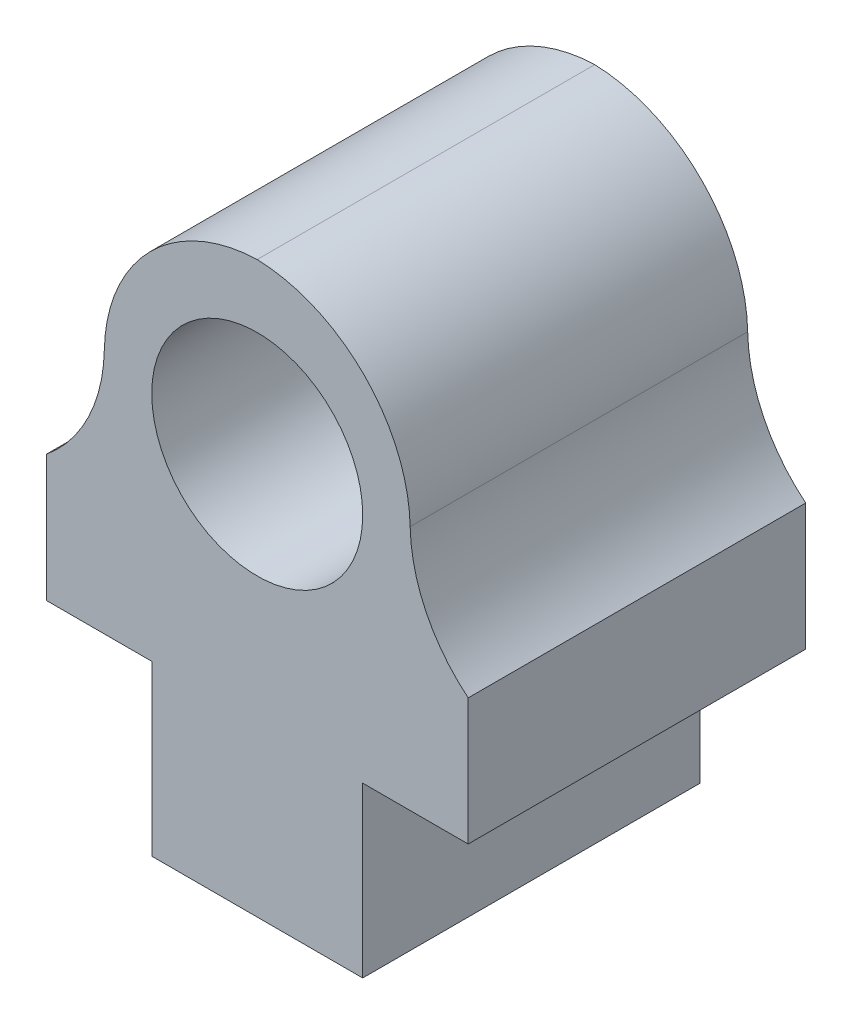
ISO-10303-21;
HEADER;
FILE_DESCRIPTION(('STEP AP214'),'2;1');
FILE_NAME('part.step','',(''),(''),'','','');
FILE_SCHEMA(('AUTOMOTIVE_DESIGN { 1 0 10303 214 1 1 1 1 }'));
ENDSEC;
DATA;
#1=APPLICATION_CONTEXT('core data for automotive mechanical design processes');
#2=APPLICATION_PROTOCOL_DEFINITION('international standard','automotive_design',2000,#1);
#3=PRODUCT_CONTEXT('',#1,'mechanical');
#4=PRODUCT('Part','Part','',(#3));
#5=PRODUCT_RELATED_PRODUCT_CATEGORY('part','',(#4));
#6=PRODUCT_DEFINITION_FORMATION('','',#4);
#7=PRODUCT_DEFINITION_CONTEXT('part definition',#1,'design');
#8=PRODUCT_DEFINITION('design','',#6,#7);
#9=PRODUCT_DEFINITION_SHAPE('','',#8);
#10=(LENGTH_UNIT() NAMED_UNIT(*) SI_UNIT(.MILLI.,.METRE.));
#11=(NAMED_UNIT(*) PLANE_ANGLE_UNIT() SI_UNIT($,.RADIAN.));
#12=(NAMED_UNIT(*) SI_UNIT($,.STERADIAN.) SOLID_ANGLE_UNIT());
#13=UNCERTAINTY_MEASURE_WITH_UNIT(LENGTH_MEASURE(1.E-05),#10,'distance_accuracy_value','');
#14=(GEOMETRIC_REPRESENTATION_CONTEXT(3) GLOBAL_UNCERTAINTY_ASSIGNED_CONTEXT((#13)) GLOBAL_UNIT_ASSIGNED_CONTEXT((#10,
#11,#12)) REPRESENTATION_CONTEXT('',''));
#15=CARTESIAN_POINT('',(0.,0.,0.));
#16=DIRECTION('',(0.,0.,1.));
#17=DIRECTION('',(1.,0.,0.));
#18=AXIS2_PLACEMENT_3D('',#15,#16,#17);
#19=CARTESIAN_POINT('',(0.,0.,0.));
#20=DIRECTION('',(0.,-1.,0.));
#21=DIRECTION('',(0.,0.,-1.));
#22=AXIS2_PLACEMENT_3D('',#19,#20,#21);
#23=PLANE('',#22);
#24=DIRECTION('',(0.,0.,-1.));
#25=VECTOR('',#24,1.);
#26=CARTESIAN_POINT('',(5.,0.,0.));
#27=LINE('',#26,#25);
#28=CARTESIAN_POINT('',(5.,0.,0.));
#29=VERTEX_POINT('',#28);
#30=CARTESIAN_POINT('',(5.,0.,-16.));
#31=VERTEX_POINT('',#30);
#32=EDGE_CURVE('E141',#29,#31,#27,.T.);
#33=ORIENTED_EDGE('',*,*,#32,.F.);
#34=DIRECTION('',(1.,0.,0.));
#35=VECTOR('',#34,1.);
#36=CARTESIAN_POINT('',(0.,0.,0.));
#37=LINE('',#36,#35);
#38=CARTESIAN_POINT('',(0.,0.,0.));
#39=VERTEX_POINT('',#38);
#40=EDGE_CURVE('E158',#39,#29,#37,.T.);
#41=ORIENTED_EDGE('',*,*,#40,.F.);
#42=DIRECTION('',(0.,0.,1.));
#43=VECTOR('',#42,1.);
#44=CARTESIAN_POINT('',(0.,0.,0.));
#45=LINE('',#44,#43);
#46=CARTESIAN_POINT('',(0.,0.,-16.));
#47=VERTEX_POINT('',#46);
#48=EDGE_CURVE('E142',#47,#39,#45,.T.);
#49=ORIENTED_EDGE('',*,*,#48,.F.);
#50=DIRECTION('',(-1.,0.,0.));
#51=VECTOR('',#50,1.);
#52=CARTESIAN_POINT('',(0.,0.,-16.));
#53=LINE('',#52,#51);
#54=EDGE_CURVE('E163',#31,#47,#53,.T.);
#55=ORIENTED_EDGE('',*,*,#54,.F.);
#56=EDGE_LOOP('',(#33,#41,#49,#55));
#57=FACE_BOUND('',#56,.T.);
#58=ADVANCED_FACE('F37',(#57),#23,.T.);
#59=CARTESIAN_POINT('',(0.,6.,0.));
#60=DIRECTION('',(1.,0.,0.));
#61=DIRECTION('',(0.,0.,-1.));
#62=AXIS2_PLACEMENT_3D('',#59,#60,#61);
#63=PLANE('',#62);
#64=ORIENTED_EDGE('',*,*,#48,.T.);
#65=DIRECTION('',(0.,-1.,0.));
#66=VECTOR('',#65,1.);
#67=CARTESIAN_POINT('',(0.,6.,0.));
#68=LINE('',#67,#66);
#69=CARTESIAN_POINT('',(0.,6.,0.));
#70=VERTEX_POINT('',#69);
#71=EDGE_CURVE('E173',#70,#39,#68,.T.);
#72=ORIENTED_EDGE('',*,*,#71,.F.);
#73=DIRECTION('',(0.,0.,1.));
#74=VECTOR('',#73,1.);
#75=CARTESIAN_POINT('',(0.,6.,0.));
#76=LINE('',#75,#74);
#77=CARTESIAN_POINT('',(0.,6.,-16.));
#78=VERTEX_POINT('',#77);
#79=EDGE_CURVE('E151',#78,#70,#76,.T.);
#80=ORIENTED_EDGE('',*,*,#79,.F.);
#81=DIRECTION('',(0.,-1.,0.));
#82=VECTOR('',#81,1.);
#83=CARTESIAN_POINT('',(0.,6.,-16.));
#84=LINE('',#83,#82);
#85=EDGE_CURVE('E156',#78,#47,#84,.T.);
#86=ORIENTED_EDGE('',*,*,#85,.T.);
#87=EDGE_LOOP('',(#64,#72,#80,#86));
#88=FACE_BOUND('',#87,.T.);
#89=ADVANCED_FACE('F204',(#88),#63,.F.);
#90=CARTESIAN_POINT('',(0.,6.,0.));
#91=DIRECTION('',(0.,0.,-1.));
#92=DIRECTION('',(-1.,0.,0.));
#93=AXIS2_PLACEMENT_3D('',#90,#91,#92);
#94=PLANE('',#93);
#95=CARTESIAN_POINT('',(10.,11.,0.));
#96=DIRECTION('',(0.,0.,1.));
#97=DIRECTION('',(1.,0.,0.));
#98=AXIS2_PLACEMENT_3D('',#95,#96,#97);
#99=CIRCLE('',#98,5.);
#100=CARTESIAN_POINT('',(15.,11.,0.));
#101=VERTEX_POINT('',#100);
#102=EDGE_CURVE('E190',#101,#101,#99,.T.);
#103=ORIENTED_EDGE('',*,*,#102,.F.);
#104=EDGE_LOOP('',(#103));
#105=FACE_BOUND('',#104,.T.);
#106=DIRECTION('',(0.,-1.,0.));
#107=VECTOR('',#106,1.);
#108=CARTESIAN_POINT('',(20.,6.,0.));
#109=LINE('',#108,#107);
#110=CARTESIAN_POINT('',(20.,6.,0.));
#111=VERTEX_POINT('',#110);
#112=CARTESIAN_POINT('',(20.,0.,0.));
#113=VERTEX_POINT('',#112);
#114=EDGE_CURVE('E170',#111,#113,#109,.T.);
#115=ORIENTED_EDGE('',*,*,#114,.F.);
#116=CARTESIAN_POINT('',(24.7468650433401,11.8066575807702,0.));
#117=DIRECTION('',(0.,0.,-1.));
#118=DIRECTION('',(-1.,0.,0.));
#119=AXIS2_PLACEMENT_3D('',#116,#117,#118);
#120=CIRCLE('',#119,7.5);
#121=CARTESIAN_POINT('',(17.2484325216701,11.6533287903851,0.));
#122=VERTEX_POINT('',#121);
#123=EDGE_CURVE('E197',#111,#122,#120,.T.);
#124=ORIENTED_EDGE('',*,*,#123,.T.);
#125=CARTESIAN_POINT('',(9.75000000000001,11.5,0.));
#126=DIRECTION('',(0.,0.,-1.));
#127=DIRECTION('',(-1.,0.,0.));
#128=AXIS2_PLACEMENT_3D('',#125,#126,#127);
#129=CIRCLE('',#128,7.5);
#130=CARTESIAN_POINT('',(10.,18.9958321752825,0.));
#131=VERTEX_POINT('',#130);
#132=EDGE_CURVE('E184',#122,#131,#129,.F.);
#133=ORIENTED_EDGE('',*,*,#132,.T.);
#134=CARTESIAN_POINT('',(10.25,11.5,0.));
#135=DIRECTION('',(0.,0.,-1.));
#136=DIRECTION('',(-1.,0.,0.));
#137=AXIS2_PLACEMENT_3D('',#134,#135,#136);
#138=CIRCLE('',#137,7.5);
#139=CARTESIAN_POINT('',(2.75156747832995,11.6533287903851,0.));
#140=VERTEX_POINT('',#139);
#141=EDGE_CURVE('E181',#131,#140,#138,.F.);
#142=ORIENTED_EDGE('',*,*,#141,.T.);
#143=CARTESIAN_POINT('',(-4.74686504334009,11.8066575807702,0.));
#144=DIRECTION('',(0.,0.,-1.));
#145=DIRECTION('',(-1.,0.,0.));
#146=AXIS2_PLACEMENT_3D('',#143,#144,#145);
#147=CIRCLE('',#146,7.5);
#148=EDGE_CURVE('E45',#140,#70,#147,.T.);
#149=ORIENTED_EDGE('',*,*,#148,.T.);
#150=ORIENTED_EDGE('',*,*,#71,.T.);
#151=ORIENTED_EDGE('',*,*,#40,.T.);
#152=DIRECTION('',(0.,1.,0.));
#153=VECTOR('',#152,1.);
#154=CARTESIAN_POINT('',(5.,-8.,0.));
#155=LINE('',#154,#153);
#156=CARTESIAN_POINT('',(5.,-8.,0.));
#157=VERTEX_POINT('',#156);
#158=EDGE_CURVE('E234',#157,#29,#155,.T.);
#159=ORIENTED_EDGE('',*,*,#158,.F.);
#160=DIRECTION('',(-1.,0.,0.));
#161=VECTOR('',#160,1.);
#162=CARTESIAN_POINT('',(5.,-8.,0.));
#163=LINE('',#162,#161);
#164=CARTESIAN_POINT('',(15.,-8.,0.));
#165=VERTEX_POINT('',#164);
#166=EDGE_CURVE('E134',#165,#157,#163,.T.);
#167=ORIENTED_EDGE('',*,*,#166,.F.);
#168=DIRECTION('',(0.,1.,0.));
#169=VECTOR('',#168,1.);
#170=CARTESIAN_POINT('',(15.,-8.,0.));
#171=LINE('',#170,#169);
#172=CARTESIAN_POINT('',(15.,0.,0.));
#173=VERTEX_POINT('',#172);
#174=EDGE_CURVE('E147',#165,#173,#171,.T.);
#175=ORIENTED_EDGE('',*,*,#174,.T.);
#176=EDGE_CURVE('E145',#173,#113,#37,.T.);
#177=ORIENTED_EDGE('',*,*,#176,.T.);
#178=EDGE_LOOP('',(#115,#124,#133,#142,#149,#150,#151,#159,#167,#175,#177));
#179=FACE_BOUND('',#178,.T.);
#180=ADVANCED_FACE('F200',(#105,#179),#94,.F.);
#181=CARTESIAN_POINT('',(20.,6.,0.));
#182=DIRECTION('',(-1.,0.,0.));
#183=DIRECTION('',(0.,0.,1.));
#184=AXIS2_PLACEMENT_3D('',#181,#182,#183);
#185=PLANE('',#184);
#186=DIRECTION('',(0.,0.,-1.));
#187=VECTOR('',#186,1.);
#188=CARTESIAN_POINT('',(20.,0.,0.));
#189=LINE('',#188,#187);
#190=CARTESIAN_POINT('',(20.,0.,-16.));
#191=VERTEX_POINT('',#190);
#192=EDGE_CURVE('E161',#113,#191,#189,.T.);
#193=ORIENTED_EDGE('',*,*,#192,.T.);
#194=DIRECTION('',(0.,-1.,0.));
#195=VECTOR('',#194,1.);
#196=CARTESIAN_POINT('',(20.,6.,-16.));
#197=LINE('',#196,#195);
#198=CARTESIAN_POINT('',(20.,6.,-16.));
#199=VERTEX_POINT('',#198);
#200=EDGE_CURVE('E167',#199,#191,#197,.T.);
#201=ORIENTED_EDGE('',*,*,#200,.F.);
#202=DIRECTION('',(0.,0.,-1.));
#203=VECTOR('',#202,1.);
#204=CARTESIAN_POINT('',(20.,6.,0.));
#205=LINE('',#204,#203);
#206=EDGE_CURVE('E153',#111,#199,#205,.T.);
#207=ORIENTED_EDGE('',*,*,#206,.F.);
#208=ORIENTED_EDGE('',*,*,#114,.T.);
#209=EDGE_LOOP('',(#193,#201,#207,#208));
#210=FACE_BOUND('',#209,.T.);
#211=ADVANCED_FACE('F220',(#210),#185,.F.);
#212=CARTESIAN_POINT('',(0.,6.,-16.));
#213=DIRECTION('',(0.,0.,1.));
#214=DIRECTION('',(1.,0.,0.));
#215=AXIS2_PLACEMENT_3D('',#212,#213,#214);
#216=PLANE('',#215);
#217=CARTESIAN_POINT('',(10.,11.,-16.));
#218=DIRECTION('',(0.,0.,1.));
#219=DIRECTION('',(1.,0.,0.));
#220=AXIS2_PLACEMENT_3D('',#217,#218,#219);
#221=CIRCLE('',#220,5.);
#222=CARTESIAN_POINT('',(15.,11.,-16.));
#223=VERTEX_POINT('',#222);
#224=EDGE_CURVE('E230',#223,#223,#221,.T.);
#225=ORIENTED_EDGE('',*,*,#224,.T.);
#226=EDGE_LOOP('',(#225));
#227=FACE_BOUND('',#226,.T.);
#228=ORIENTED_EDGE('',*,*,#85,.F.);
#229=CARTESIAN_POINT('',(-4.7468650433401,11.8066575807702,-16.));
#230=DIRECTION('',(0.,0.,1.));
#231=DIRECTION('',(1.,0.,0.));
#232=AXIS2_PLACEMENT_3D('',#229,#230,#231);
#233=CIRCLE('',#232,7.5);
#234=CARTESIAN_POINT('',(2.75156747832995,11.6533287903851,-16.));
#235=VERTEX_POINT('',#234);
#236=EDGE_CURVE('E11',#78,#235,#233,.T.);
#237=ORIENTED_EDGE('',*,*,#236,.T.);
#238=CARTESIAN_POINT('',(10.25,11.5,-16.));
#239=DIRECTION('',(0.,0.,1.));
#240=DIRECTION('',(1.,0.,0.));
#241=AXIS2_PLACEMENT_3D('',#238,#239,#240);
#242=CIRCLE('',#241,7.5);
#243=CARTESIAN_POINT('',(10.,18.9958321752825,-16.));
#244=VERTEX_POINT('',#243);
#245=EDGE_CURVE('E176',#235,#244,#242,.F.);
#246=ORIENTED_EDGE('',*,*,#245,.T.);
#247=CARTESIAN_POINT('',(9.75,11.5,-16.));
#248=DIRECTION('',(0.,0.,1.));
#249=DIRECTION('',(1.,0.,0.));
#250=AXIS2_PLACEMENT_3D('',#247,#248,#249);
#251=CIRCLE('',#250,7.5);
#252=CARTESIAN_POINT('',(17.24843252167,11.6533287903851,-16.));
#253=VERTEX_POINT('',#252);
#254=EDGE_CURVE('E178',#244,#253,#251,.F.);
#255=ORIENTED_EDGE('',*,*,#254,.T.);
#256=CARTESIAN_POINT('',(24.7468650433401,11.8066575807702,-16.));
#257=DIRECTION('',(0.,0.,1.));
#258=DIRECTION('',(1.,0.,0.));
#259=AXIS2_PLACEMENT_3D('',#256,#257,#258);
#260=CIRCLE('',#259,7.5);
#261=EDGE_CURVE('E195',#253,#199,#260,.T.);
#262=ORIENTED_EDGE('',*,*,#261,.T.);
#263=ORIENTED_EDGE('',*,*,#200,.T.);
#264=CARTESIAN_POINT('',(15.,0.,-16.));
#265=VERTEX_POINT('',#264);
#266=EDGE_CURVE('E154',#191,#265,#53,.T.);
#267=ORIENTED_EDGE('',*,*,#266,.T.);
#268=DIRECTION('',(0.,1.,0.));
#269=VECTOR('',#268,1.);
#270=CARTESIAN_POINT('',(15.,-8.,-16.));
#271=LINE('',#270,#269);
#272=CARTESIAN_POINT('',(15.,-8.,-16.));
#273=VERTEX_POINT('',#272);
#274=EDGE_CURVE('E125',#273,#265,#271,.T.);
#275=ORIENTED_EDGE('',*,*,#274,.F.);
#276=DIRECTION('',(1.,0.,0.));
#277=VECTOR('',#276,1.);
#278=CARTESIAN_POINT('',(5.,-8.,-16.));
#279=LINE('',#278,#277);
#280=CARTESIAN_POINT('',(5.,-8.,-16.));
#281=VERTEX_POINT('',#280);
#282=EDGE_CURVE('E117',#281,#273,#279,.T.);
#283=ORIENTED_EDGE('',*,*,#282,.F.);
#284=DIRECTION('',(0.,1.,0.));
#285=VECTOR('',#284,1.);
#286=CARTESIAN_POINT('',(5.,-8.,-16.));
#287=LINE('',#286,#285);
#288=EDGE_CURVE('E121',#281,#31,#287,.T.);
#289=ORIENTED_EDGE('',*,*,#288,.T.);
#290=ORIENTED_EDGE('',*,*,#54,.T.);
#291=EDGE_LOOP('',(#228,#237,#246,#255,#262,#263,#267,#275,#283,#289,#290));
#292=FACE_BOUND('',#291,.T.);
#293=ADVANCED_FACE('F119',(#227,#292),#216,.F.);
#294=DIRECTION('',(0.,0.,1.));
#295=VECTOR('',#294,1.);
#296=CARTESIAN_POINT('',(15.,0.,0.));
#297=LINE('',#296,#295);
#298=EDGE_CURVE('E138',#265,#173,#297,.T.);
#299=ORIENTED_EDGE('',*,*,#298,.F.);
#300=ORIENTED_EDGE('',*,*,#266,.F.);
#301=ORIENTED_EDGE('',*,*,#192,.F.);
#302=ORIENTED_EDGE('',*,*,#176,.F.);
#303=EDGE_LOOP('',(#299,#300,#301,#302));
#304=FACE_BOUND('',#303,.T.);
#305=ADVANCED_FACE('F224',(#304),#23,.T.);
#306=CARTESIAN_POINT('',(5.,-8.,0.));
#307=DIRECTION('',(1.,0.,0.));
#308=DIRECTION('',(0.,0.,-1.));
#309=AXIS2_PLACEMENT_3D('',#306,#307,#308);
#310=PLANE('',#309);
#311=ORIENTED_EDGE('',*,*,#32,.T.);
#312=ORIENTED_EDGE('',*,*,#288,.F.);
#313=DIRECTION('',(0.,0.,-1.));
#314=VECTOR('',#313,1.);
#315=CARTESIAN_POINT('',(5.,-8.,0.));
#316=LINE('',#315,#314);
#317=EDGE_CURVE('E129',#157,#281,#316,.T.);
#318=ORIENTED_EDGE('',*,*,#317,.F.);
#319=ORIENTED_EDGE('',*,*,#158,.T.);
#320=EDGE_LOOP('',(#311,#312,#318,#319));
#321=FACE_BOUND('',#320,.T.);
#322=ADVANCED_FACE('F140',(#321),#310,.F.);
#323=CARTESIAN_POINT('',(15.,-8.,0.));
#324=DIRECTION('',(-1.,0.,0.));
#325=DIRECTION('',(0.,0.,1.));
#326=AXIS2_PLACEMENT_3D('',#323,#324,#325);
#327=PLANE('',#326);
#328=ORIENTED_EDGE('',*,*,#298,.T.);
#329=ORIENTED_EDGE('',*,*,#174,.F.);
#330=DIRECTION('',(0.,0.,1.));
#331=VECTOR('',#330,1.);
#332=CARTESIAN_POINT('',(15.,-8.,0.));
#333=LINE('',#332,#331);
#334=EDGE_CURVE('E128',#273,#165,#333,.T.);
#335=ORIENTED_EDGE('',*,*,#334,.F.);
#336=ORIENTED_EDGE('',*,*,#274,.T.);
#337=EDGE_LOOP('',(#328,#329,#335,#336));
#338=FACE_BOUND('',#337,.T.);
#339=ADVANCED_FACE('F235',(#338),#327,.F.);
#340=CARTESIAN_POINT('',(0.,-8.,0.));
#341=DIRECTION('',(0.,-1.,0.));
#342=DIRECTION('',(0.,0.,-1.));
#343=AXIS2_PLACEMENT_3D('',#340,#341,#342);
#344=PLANE('',#343);
#345=ORIENTED_EDGE('',*,*,#317,.T.);
#346=ORIENTED_EDGE('',*,*,#282,.T.);
#347=ORIENTED_EDGE('',*,*,#334,.T.);
#348=ORIENTED_EDGE('',*,*,#166,.T.);
#349=EDGE_LOOP('',(#345,#346,#347,#348));
#350=FACE_BOUND('',#349,.T.);
#351=ADVANCED_FACE('F132',(#350),#344,.T.);
#352=CARTESIAN_POINT('',(10.,11.,-16.));
#353=DIRECTION('',(0.,0.,1.));
#354=DIRECTION('',(1.,0.,0.));
#355=AXIS2_PLACEMENT_3D('',#352,#353,#354);
#356=CYLINDRICAL_SURFACE('',#355,5.);
#357=ORIENTED_EDGE('',*,*,#224,.F.);
#358=EDGE_LOOP('',(#357));
#359=FACE_BOUND('',#358,.T.);
#360=ORIENTED_EDGE('',*,*,#102,.T.);
#361=EDGE_LOOP('',(#360));
#362=FACE_BOUND('',#361,.T.);
#363=ADVANCED_FACE('F244',(#359,#362),#356,.F.);
#364=CARTESIAN_POINT('',(10.25,11.5,0.));
#365=DIRECTION('',(0.,0.,-1.));
#366=DIRECTION('',(-1.,0.,0.));
#367=AXIS2_PLACEMENT_3D('',#364,#365,#366);
#368=CYLINDRICAL_SURFACE('',#367,7.5);
#369=ORIENTED_EDGE('',*,*,#245,.F.);
#370=DIRECTION('',(0.,0.,-1.));
#371=VECTOR('',#370,1.);
#372=CARTESIAN_POINT('',(2.75156747832995,11.6533287903851,0.));
#373=LINE('',#372,#371);
#374=EDGE_CURVE('E193',#235,#140,#373,.F.);
#375=ORIENTED_EDGE('',*,*,#374,.T.);
#376=ORIENTED_EDGE('',*,*,#141,.F.);
#377=DIRECTION('',(0.,0.,-1.));
#378=VECTOR('',#377,1.);
#379=CARTESIAN_POINT('',(10.,18.9958321752825,-8.));
#380=LINE('',#379,#378);
#381=EDGE_CURVE('E187',#244,#131,#380,.F.);
#382=ORIENTED_EDGE('',*,*,#381,.F.);
#383=EDGE_LOOP('',(#369,#375,#376,#382));
#384=FACE_BOUND('',#383,.T.);
#385=ADVANCED_FACE('F207',(#384),#368,.T.);
#386=CARTESIAN_POINT('',(9.75000000000001,11.5,0.));
#387=DIRECTION('',(0.,0.,1.));
#388=DIRECTION('',(1.,0.,0.));
#389=AXIS2_PLACEMENT_3D('',#386,#387,#388);
#390=CYLINDRICAL_SURFACE('',#389,7.5);
#391=ORIENTED_EDGE('',*,*,#132,.F.);
#392=DIRECTION('',(0.,0.,1.));
#393=VECTOR('',#392,1.);
#394=CARTESIAN_POINT('',(17.2484325216701,11.6533287903851,0.));
#395=LINE('',#394,#393);
#396=EDGE_CURVE('E186',#122,#253,#395,.F.);
#397=ORIENTED_EDGE('',*,*,#396,.T.);
#398=ORIENTED_EDGE('',*,*,#254,.F.);
#399=ORIENTED_EDGE('',*,*,#381,.T.);
#400=EDGE_LOOP('',(#391,#397,#398,#399));
#401=FACE_BOUND('',#400,.T.);
#402=ADVANCED_FACE('F213',(#401),#390,.T.);
#403=CARTESIAN_POINT('',(24.7468650433401,11.8066575807702,0.));
#404=DIRECTION('',(0.,0.,1.));
#405=DIRECTION('',(1.,0.,0.));
#406=AXIS2_PLACEMENT_3D('',#403,#404,#405);
#407=CYLINDRICAL_SURFACE('',#406,7.5);
#408=ORIENTED_EDGE('',*,*,#123,.F.);
#409=ORIENTED_EDGE('',*,*,#206,.T.);
#410=ORIENTED_EDGE('',*,*,#261,.F.);
#411=ORIENTED_EDGE('',*,*,#396,.F.);
#412=EDGE_LOOP('',(#408,#409,#410,#411));
#413=FACE_BOUND('',#412,.T.);
#414=ADVANCED_FACE('F217',(#413),#407,.F.);
#415=CARTESIAN_POINT('',(-4.74686504334009,11.8066575807702,0.));
#416=DIRECTION('',(0.,0.,-1.));
#417=DIRECTION('',(-1.,0.,0.));
#418=AXIS2_PLACEMENT_3D('',#415,#416,#417);
#419=CYLINDRICAL_SURFACE('',#418,7.5);
#420=ORIENTED_EDGE('',*,*,#236,.F.);
#421=ORIENTED_EDGE('',*,*,#79,.T.);
#422=ORIENTED_EDGE('',*,*,#148,.F.);
#423=ORIENTED_EDGE('',*,*,#374,.F.);
#424=EDGE_LOOP('',(#420,#421,#422,#423));
#425=FACE_BOUND('',#424,.T.);
#426=ADVANCED_FACE('F39',(#425),#419,.F.);
#427=CLOSED_SHELL('',(#58,#89,#180,#211,#293,#305,#322,#339,#351,#363,#385,#402,#414,#426));
#428=MANIFOLD_SOLID_BREP('B2',#427);
#429=ADVANCED_BREP_SHAPE_REPRESENTATION('',(#18,#428),#14);
#430=SHAPE_DEFINITION_REPRESENTATION(#9,#429);
ENDSEC;
END-ISO-10303-21;
